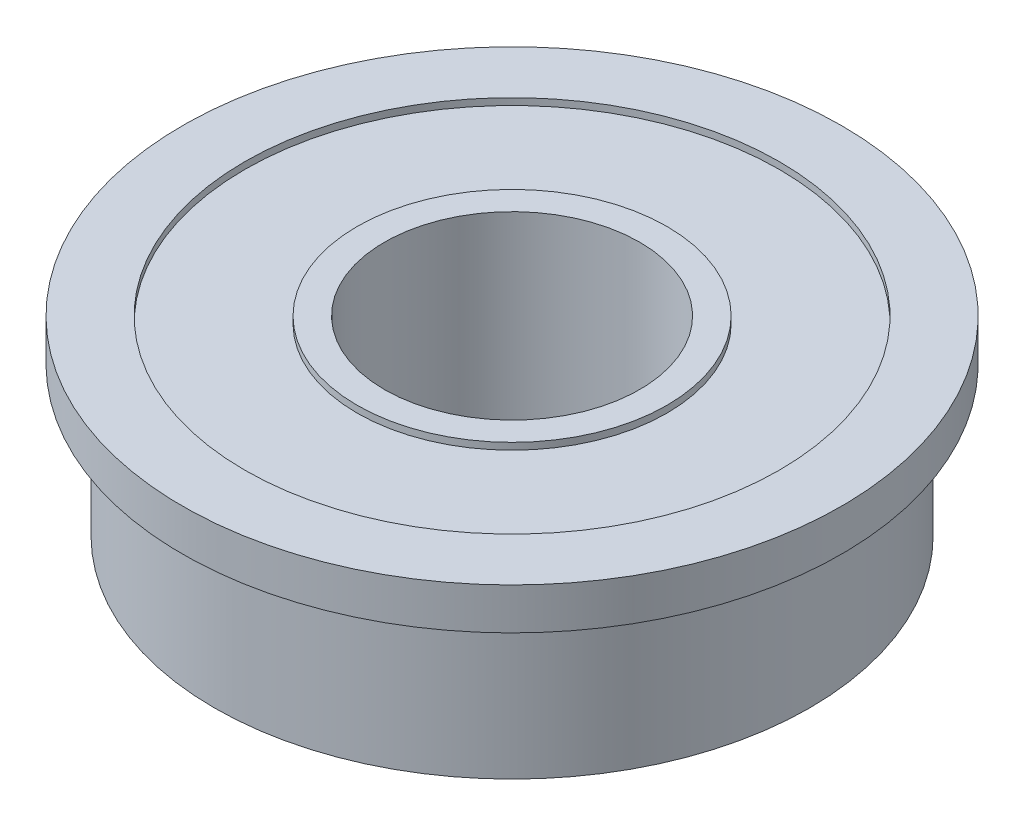
ISO-10303-21;
HEADER;
FILE_DESCRIPTION(('STEP AP214'),'2;1');
FILE_NAME('part.step','',(''),(''),'','','');
FILE_SCHEMA(('AUTOMOTIVE_DESIGN { 1 0 10303 214 1 1 1 1 }'));
ENDSEC;
DATA;
#1=APPLICATION_CONTEXT('core data for automotive mechanical design processes');
#2=APPLICATION_PROTOCOL_DEFINITION('international standard','automotive_design',2000,#1);
#3=PRODUCT_CONTEXT('',#1,'mechanical');
#4=PRODUCT('Part','Part','',(#3));
#5=PRODUCT_RELATED_PRODUCT_CATEGORY('part','',(#4));
#6=PRODUCT_DEFINITION_FORMATION('','',#4);
#7=PRODUCT_DEFINITION_CONTEXT('part definition',#1,'design');
#8=PRODUCT_DEFINITION('design','',#6,#7);
#9=PRODUCT_DEFINITION_SHAPE('','',#8);
#10=(LENGTH_UNIT() NAMED_UNIT(*) SI_UNIT(.MILLI.,.METRE.));
#11=(NAMED_UNIT(*) PLANE_ANGLE_UNIT() SI_UNIT($,.RADIAN.));
#12=(NAMED_UNIT(*) SI_UNIT($,.STERADIAN.) SOLID_ANGLE_UNIT());
#13=UNCERTAINTY_MEASURE_WITH_UNIT(LENGTH_MEASURE(1.E-05),#10,'distance_accuracy_value','');
#14=(GEOMETRIC_REPRESENTATION_CONTEXT(3) GLOBAL_UNCERTAINTY_ASSIGNED_CONTEXT((#13)) GLOBAL_UNIT_ASSIGNED_CONTEXT((#10,
#11,#12)) REPRESENTATION_CONTEXT('',''));
#15=CARTESIAN_POINT('',(0.,0.,0.));
#16=DIRECTION('',(0.,0.,1.));
#17=DIRECTION('',(1.,0.,0.));
#18=AXIS2_PLACEMENT_3D('',#15,#16,#17);
#19=CARTESIAN_POINT('',(0.,0.254,0.));
#20=DIRECTION('',(0.,-1.,0.));
#21=DIRECTION('',(0.,0.,-1.));
#22=AXIS2_PLACEMENT_3D('',#19,#20,#21);
#23=CYLINDRICAL_SURFACE('',#22,9.9695);
#24=CARTESIAN_POINT('',(0.,0.254,0.));
#25=DIRECTION('',(0.,-1.,0.));
#26=DIRECTION('',(0.,0.,-1.));
#27=AXIS2_PLACEMENT_3D('',#24,#25,#26);
#28=CIRCLE('',#27,9.9695);
#29=CARTESIAN_POINT('',(0.,0.254,-9.9695));
#30=VERTEX_POINT('',#29);
#31=EDGE_CURVE('E18',#30,#30,#28,.T.);
#32=ORIENTED_EDGE('',*,*,#31,.F.);
#33=EDGE_LOOP('',(#32));
#34=FACE_BOUND('',#33,.T.);
#35=CARTESIAN_POINT('',(0.,0.,0.));
#36=DIRECTION('',(0.,-1.,0.));
#37=DIRECTION('',(0.,0.,-1.));
#38=AXIS2_PLACEMENT_3D('',#35,#36,#37);
#39=CIRCLE('',#38,9.9695);
#40=CARTESIAN_POINT('',(0.,0.,-9.9695));
#41=VERTEX_POINT('',#40);
#42=EDGE_CURVE('E58',#41,#41,#39,.T.);
#43=ORIENTED_EDGE('',*,*,#42,.T.);
#44=EDGE_LOOP('',(#43));
#45=FACE_BOUND('',#44,.T.);
#46=ADVANCED_FACE('F15',(#34,#45),#23,.F.);
#47=CARTESIAN_POINT('',(0.,0.254,0.));
#48=DIRECTION('',(0.,-1.,0.));
#49=DIRECTION('',(0.,0.,-1.));
#50=AXIS2_PLACEMENT_3D('',#47,#48,#49);
#51=PLANE('',#50);
#52=ORIENTED_EDGE('',*,*,#31,.T.);
#53=EDGE_LOOP('',(#52));
#54=FACE_BOUND('',#53,.T.);
#55=CARTESIAN_POINT('',(0.,0.254,0.));
#56=DIRECTION('',(0.,-1.,0.));
#57=DIRECTION('',(0.,0.,-1.));
#58=AXIS2_PLACEMENT_3D('',#55,#56,#57);
#59=CIRCLE('',#58,5.7785);
#60=CARTESIAN_POINT('',(0.,0.254,-5.7785));
#61=VERTEX_POINT('',#60);
#62=EDGE_CURVE('E56',#61,#61,#59,.T.);
#63=ORIENTED_EDGE('',*,*,#62,.F.);
#64=EDGE_LOOP('',(#63));
#65=FACE_BOUND('',#64,.T.);
#66=ADVANCED_FACE('F65',(#54,#65),#51,.T.);
#67=CARTESIAN_POINT('',(0.,0.,0.));
#68=DIRECTION('',(0.,1.,0.));
#69=DIRECTION('',(0.,0.,1.));
#70=AXIS2_PLACEMENT_3D('',#67,#68,#69);
#71=PLANE('',#70);
#72=CARTESIAN_POINT('',(0.,0.,0.));
#73=DIRECTION('',(0.,-1.,0.));
#74=DIRECTION('',(0.,0.,-1.));
#75=AXIS2_PLACEMENT_3D('',#72,#73,#74);
#76=CIRCLE('',#75,11.10615);
#77=CARTESIAN_POINT('',(0.,0.,-11.10615));
#78=VERTEX_POINT('',#77);
#79=EDGE_CURVE('E53',#78,#78,#76,.F.);
#80=ORIENTED_EDGE('',*,*,#79,.F.);
#81=EDGE_LOOP('',(#80));
#82=FACE_BOUND('',#81,.T.);
#83=ORIENTED_EDGE('',*,*,#42,.F.);
#84=EDGE_LOOP('',(#83));
#85=FACE_BOUND('',#84,.T.);
#86=ADVANCED_FACE('F72',(#82,#85),#71,.F.);
#87=CARTESIAN_POINT('',(0.,0.254,0.));
#88=DIRECTION('',(0.,-1.,0.));
#89=DIRECTION('',(0.,0.,-1.));
#90=AXIS2_PLACEMENT_3D('',#87,#88,#89);
#91=CYLINDRICAL_SURFACE('',#90,5.7785);
#92=CARTESIAN_POINT('',(0.,0.,0.));
#93=DIRECTION('',(0.,-1.,0.));
#94=DIRECTION('',(0.,0.,-1.));
#95=AXIS2_PLACEMENT_3D('',#92,#93,#94);
#96=CIRCLE('',#95,5.7785);
#97=CARTESIAN_POINT('',(0.,0.,-5.7785));
#98=VERTEX_POINT('',#97);
#99=EDGE_CURVE('E50',#98,#98,#96,.F.);
#100=ORIENTED_EDGE('',*,*,#99,.T.);
#101=EDGE_LOOP('',(#100));
#102=FACE_BOUND('',#101,.T.);
#103=ORIENTED_EDGE('',*,*,#62,.T.);
#104=EDGE_LOOP('',(#103));
#105=FACE_BOUND('',#104,.T.);
#106=ADVANCED_FACE('F115',(#102,#105),#91,.T.);
#107=CARTESIAN_POINT('',(0.,5.5626,0.));
#108=DIRECTION('',(0.,-1.,0.));
#109=DIRECTION('',(0.,0.,-1.));
#110=AXIS2_PLACEMENT_3D('',#107,#108,#109);
#111=CYLINDRICAL_SURFACE('',#110,11.10615);
#112=CARTESIAN_POINT('',(0.,5.5626,0.));
#113=DIRECTION('',(0.,-1.,0.));
#114=DIRECTION('',(0.,0.,-1.));
#115=AXIS2_PLACEMENT_3D('',#112,#113,#114);
#116=CIRCLE('',#115,11.10615);
#117=CARTESIAN_POINT('',(0.,5.5626,-11.10615));
#118=VERTEX_POINT('',#117);
#119=EDGE_CURVE('E47',#118,#118,#116,.T.);
#120=ORIENTED_EDGE('',*,*,#119,.T.);
#121=EDGE_LOOP('',(#120));
#122=FACE_BOUND('',#121,.T.);
#123=ORIENTED_EDGE('',*,*,#79,.T.);
#124=EDGE_LOOP('',(#123));
#125=FACE_BOUND('',#124,.T.);
#126=ADVANCED_FACE('F111',(#122,#125),#111,.T.);
#127=CARTESIAN_POINT('',(0.,0.,0.));
#128=DIRECTION('',(0.,1.,0.));
#129=DIRECTION('',(0.,0.,1.));
#130=AXIS2_PLACEMENT_3D('',#127,#128,#129);
#131=PLANE('',#130);
#132=ORIENTED_EDGE('',*,*,#99,.F.);
#133=EDGE_LOOP('',(#132));
#134=FACE_BOUND('',#133,.T.);
#135=CARTESIAN_POINT('',(0.,0.,0.));
#136=DIRECTION('',(0.,1.,0.));
#137=DIRECTION('',(0.,0.,1.));
#138=AXIS2_PLACEMENT_3D('',#135,#136,#137);
#139=CIRCLE('',#138,4.7625);
#140=CARTESIAN_POINT('',(0.,0.,4.7625));
#141=VERTEX_POINT('',#140);
#142=EDGE_CURVE('E44',#141,#141,#139,.T.);
#143=ORIENTED_EDGE('',*,*,#142,.T.);
#144=EDGE_LOOP('',(#143));
#145=FACE_BOUND('',#144,.T.);
#146=ADVANCED_FACE('F107',(#134,#145),#131,.F.);
#147=CARTESIAN_POINT('',(0.,5.5626,0.));
#148=DIRECTION('',(0.,1.,0.));
#149=DIRECTION('',(0.,0.,1.));
#150=AXIS2_PLACEMENT_3D('',#147,#148,#149);
#151=PLANE('',#150);
#152=ORIENTED_EDGE('',*,*,#119,.F.);
#153=EDGE_LOOP('',(#152));
#154=FACE_BOUND('',#153,.T.);
#155=CARTESIAN_POINT('',(0.,5.5626,0.));
#156=DIRECTION('',(0.,-1.,0.));
#157=DIRECTION('',(0.,0.,-1.));
#158=AXIS2_PLACEMENT_3D('',#155,#156,#157);
#159=CIRCLE('',#158,12.2936);
#160=CARTESIAN_POINT('',(0.,5.5626,-12.2936));
#161=VERTEX_POINT('',#160);
#162=EDGE_CURVE('E41',#161,#161,#159,.F.);
#163=ORIENTED_EDGE('',*,*,#162,.F.);
#164=EDGE_LOOP('',(#163));
#165=FACE_BOUND('',#164,.T.);
#166=ADVANCED_FACE('F103',(#154,#165),#151,.F.);
#167=CARTESIAN_POINT('',(0.,0.,0.));
#168=DIRECTION('',(0.,1.,0.));
#169=DIRECTION('',(0.,0.,1.));
#170=AXIS2_PLACEMENT_3D('',#167,#168,#169);
#171=CYLINDRICAL_SURFACE('',#170,4.7625);
#172=CARTESIAN_POINT('',(0.,7.112,0.));
#173=DIRECTION('',(0.,1.,0.));
#174=DIRECTION('',(0.,0.,1.));
#175=AXIS2_PLACEMENT_3D('',#172,#173,#174);
#176=CIRCLE('',#175,4.7625);
#177=CARTESIAN_POINT('',(0.,7.112,4.7625));
#178=VERTEX_POINT('',#177);
#179=EDGE_CURVE('E38',#178,#178,#176,.F.);
#180=ORIENTED_EDGE('',*,*,#179,.F.);
#181=EDGE_LOOP('',(#180));
#182=FACE_BOUND('',#181,.T.);
#183=ORIENTED_EDGE('',*,*,#142,.F.);
#184=EDGE_LOOP('',(#183));
#185=FACE_BOUND('',#184,.T.);
#186=ADVANCED_FACE('F99',(#182,#185),#171,.F.);
#187=CARTESIAN_POINT('',(0.,7.112,0.));
#188=DIRECTION('',(0.,-1.,0.));
#189=DIRECTION('',(0.,0.,-1.));
#190=AXIS2_PLACEMENT_3D('',#187,#188,#189);
#191=CYLINDRICAL_SURFACE('',#190,12.2936);
#192=ORIENTED_EDGE('',*,*,#162,.T.);
#193=EDGE_LOOP('',(#192));
#194=FACE_BOUND('',#193,.T.);
#195=CARTESIAN_POINT('',(0.,7.112,0.));
#196=DIRECTION('',(0.,-1.,0.));
#197=DIRECTION('',(0.,0.,-1.));
#198=AXIS2_PLACEMENT_3D('',#195,#196,#197);
#199=CIRCLE('',#198,12.2936);
#200=CARTESIAN_POINT('',(0.,7.112,-12.2936));
#201=VERTEX_POINT('',#200);
#202=EDGE_CURVE('E35',#201,#201,#199,.F.);
#203=ORIENTED_EDGE('',*,*,#202,.F.);
#204=EDGE_LOOP('',(#203));
#205=FACE_BOUND('',#204,.T.);
#206=ADVANCED_FACE('F95',(#194,#205),#191,.T.);
#207=CARTESIAN_POINT('',(0.,7.112,0.));
#208=DIRECTION('',(0.,1.,0.));
#209=DIRECTION('',(0.,0.,1.));
#210=AXIS2_PLACEMENT_3D('',#207,#208,#209);
#211=PLANE('',#210);
#212=CARTESIAN_POINT('',(0.,7.112,0.));
#213=DIRECTION('',(0.,1.,0.));
#214=DIRECTION('',(0.,0.,1.));
#215=AXIS2_PLACEMENT_3D('',#212,#213,#214);
#216=CIRCLE('',#215,5.7785);
#217=CARTESIAN_POINT('',(0.,7.112,5.7785));
#218=VERTEX_POINT('',#217);
#219=EDGE_CURVE('E32',#218,#218,#216,.F.);
#220=ORIENTED_EDGE('',*,*,#219,.F.);
#221=EDGE_LOOP('',(#220));
#222=FACE_BOUND('',#221,.T.);
#223=ORIENTED_EDGE('',*,*,#179,.T.);
#224=EDGE_LOOP('',(#223));
#225=FACE_BOUND('',#224,.T.);
#226=ADVANCED_FACE('F91',(#222,#225),#211,.T.);
#227=CARTESIAN_POINT('',(0.,7.112,0.));
#228=DIRECTION('',(0.,1.,0.));
#229=DIRECTION('',(0.,0.,1.));
#230=AXIS2_PLACEMENT_3D('',#227,#228,#229);
#231=PLANE('',#230);
#232=ORIENTED_EDGE('',*,*,#202,.T.);
#233=EDGE_LOOP('',(#232));
#234=FACE_BOUND('',#233,.T.);
#235=CARTESIAN_POINT('',(0.,7.112,0.));
#236=DIRECTION('',(0.,1.,0.));
#237=DIRECTION('',(0.,0.,1.));
#238=AXIS2_PLACEMENT_3D('',#235,#236,#237);
#239=CIRCLE('',#238,9.9695);
#240=CARTESIAN_POINT('',(0.,7.112,9.9695));
#241=VERTEX_POINT('',#240);
#242=EDGE_CURVE('E27',#241,#241,#239,.F.);
#243=ORIENTED_EDGE('',*,*,#242,.T.);
#244=EDGE_LOOP('',(#243));
#245=FACE_BOUND('',#244,.T.);
#246=ADVANCED_FACE('F87',(#234,#245),#231,.T.);
#247=CARTESIAN_POINT('',(0.,6.858,0.));
#248=DIRECTION('',(0.,1.,0.));
#249=DIRECTION('',(0.,0.,1.));
#250=AXIS2_PLACEMENT_3D('',#247,#248,#249);
#251=CYLINDRICAL_SURFACE('',#250,5.7785);
#252=CARTESIAN_POINT('',(0.,6.858,0.));
#253=DIRECTION('',(0.,1.,0.));
#254=DIRECTION('',(0.,0.,1.));
#255=AXIS2_PLACEMENT_3D('',#252,#253,#254);
#256=CIRCLE('',#255,5.7785);
#257=CARTESIAN_POINT('',(0.,6.858,5.7785));
#258=VERTEX_POINT('',#257);
#259=EDGE_CURVE('E22',#258,#258,#256,.F.);
#260=ORIENTED_EDGE('',*,*,#259,.F.);
#261=EDGE_LOOP('',(#260));
#262=FACE_BOUND('',#261,.T.);
#263=ORIENTED_EDGE('',*,*,#219,.T.);
#264=EDGE_LOOP('',(#263));
#265=FACE_BOUND('',#264,.T.);
#266=ADVANCED_FACE('F80',(#262,#265),#251,.T.);
#267=CARTESIAN_POINT('',(0.,6.858,0.));
#268=DIRECTION('',(0.,1.,0.));
#269=DIRECTION('',(0.,0.,1.));
#270=AXIS2_PLACEMENT_3D('',#267,#268,#269);
#271=CYLINDRICAL_SURFACE('',#270,9.9695);
#272=ORIENTED_EDGE('',*,*,#242,.F.);
#273=EDGE_LOOP('',(#272));
#274=FACE_BOUND('',#273,.T.);
#275=CARTESIAN_POINT('',(0.,6.858,0.));
#276=DIRECTION('',(0.,1.,0.));
#277=DIRECTION('',(0.,0.,1.));
#278=AXIS2_PLACEMENT_3D('',#275,#276,#277);
#279=CIRCLE('',#278,9.9695);
#280=CARTESIAN_POINT('',(0.,6.858,9.9695));
#281=VERTEX_POINT('',#280);
#282=EDGE_CURVE('E9',#281,#281,#279,.T.);
#283=ORIENTED_EDGE('',*,*,#282,.F.);
#284=EDGE_LOOP('',(#283));
#285=FACE_BOUND('',#284,.T.);
#286=ADVANCED_FACE('F75',(#274,#285),#271,.F.);
#287=CARTESIAN_POINT('',(0.,6.858,0.));
#288=DIRECTION('',(0.,1.,0.));
#289=DIRECTION('',(0.,0.,1.));
#290=AXIS2_PLACEMENT_3D('',#287,#288,#289);
#291=PLANE('',#290);
#292=ORIENTED_EDGE('',*,*,#282,.T.);
#293=EDGE_LOOP('',(#292));
#294=FACE_BOUND('',#293,.T.);
#295=ORIENTED_EDGE('',*,*,#259,.T.);
#296=EDGE_LOOP('',(#295));
#297=FACE_BOUND('',#296,.T.);
#298=ADVANCED_FACE('F73',(#294,#297),#291,.T.);
#299=CLOSED_SHELL('',(#46,#66,#86,#106,#126,#146,#166,#186,#206,#226,#246,#266,#286,#298));
#300=MANIFOLD_SOLID_BREP('B1',#299);
#301=ADVANCED_BREP_SHAPE_REPRESENTATION('',(#18,#300),#14);
#302=SHAPE_DEFINITION_REPRESENTATION(#9,#301);
ENDSEC;
END-ISO-10303-21;
